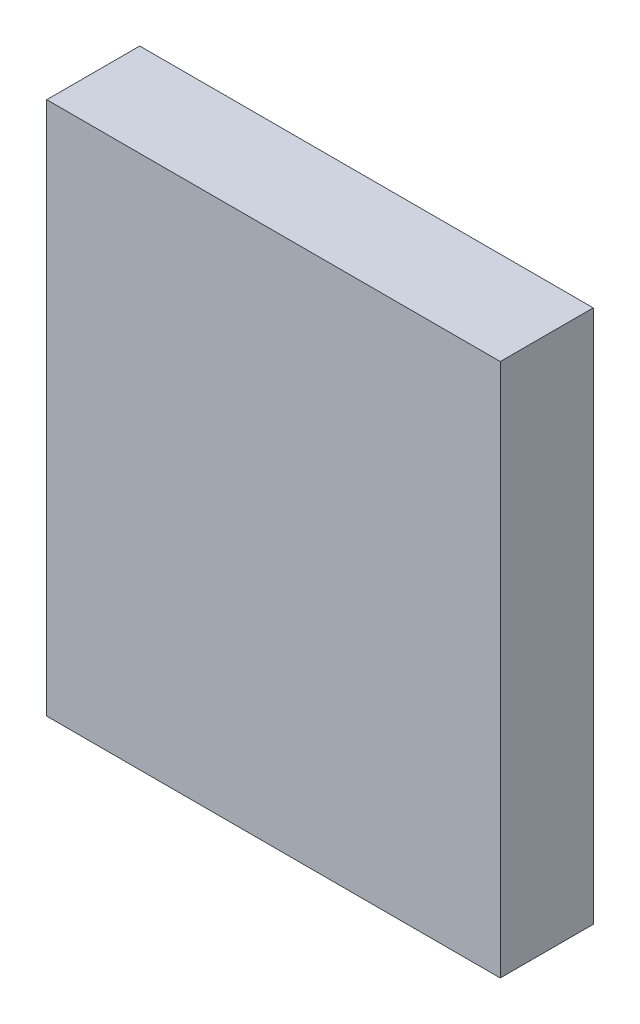
ISO-10303-21;
HEADER;
FILE_DESCRIPTION(('STEP AP214'),'2;1');
FILE_NAME('part.step','',(''),(''),'','','');
FILE_SCHEMA(('AUTOMOTIVE_DESIGN { 1 0 10303 214 1 1 1 1 }'));
ENDSEC;
DATA;
#1=APPLICATION_CONTEXT('core data for automotive mechanical design processes');
#2=APPLICATION_PROTOCOL_DEFINITION('international standard','automotive_design',2000,#1);
#3=PRODUCT_CONTEXT('',#1,'mechanical');
#4=PRODUCT('Part','Part','',(#3));
#5=PRODUCT_RELATED_PRODUCT_CATEGORY('part','',(#4));
#6=PRODUCT_DEFINITION_FORMATION('','',#4);
#7=PRODUCT_DEFINITION_CONTEXT('part definition',#1,'design');
#8=PRODUCT_DEFINITION('design','',#6,#7);
#9=PRODUCT_DEFINITION_SHAPE('','',#8);
#10=(LENGTH_UNIT() NAMED_UNIT(*) SI_UNIT(.MILLI.,.METRE.));
#11=(NAMED_UNIT(*) PLANE_ANGLE_UNIT() SI_UNIT($,.RADIAN.));
#12=(NAMED_UNIT(*) SI_UNIT($,.STERADIAN.) SOLID_ANGLE_UNIT());
#13=UNCERTAINTY_MEASURE_WITH_UNIT(LENGTH_MEASURE(1.E-05),#10,'distance_accuracy_value','');
#14=(GEOMETRIC_REPRESENTATION_CONTEXT(3) GLOBAL_UNCERTAINTY_ASSIGNED_CONTEXT((#13)) GLOBAL_UNIT_ASSIGNED_CONTEXT((#10,
#11,#12)) REPRESENTATION_CONTEXT('',''));
#15=CARTESIAN_POINT('',(0.,0.,0.));
#16=DIRECTION('',(0.,0.,1.));
#17=DIRECTION('',(1.,0.,0.));
#18=AXIS2_PLACEMENT_3D('',#15,#16,#17);
#19=CARTESIAN_POINT('',(-2.4382,-2.8702,1.));
#20=DIRECTION('',(1.,0.,0.));
#21=DIRECTION('',(0.,0.,-1.));
#22=AXIS2_PLACEMENT_3D('',#19,#20,#21);
#23=PLANE('',#22);
#24=DIRECTION('',(0.,-1.,0.));
#25=VECTOR('',#24,1.);
#26=CARTESIAN_POINT('',(-2.4382,-2.8702,0.));
#27=LINE('',#26,#25);
#28=CARTESIAN_POINT('',(-2.4382,2.8702,0.));
#29=VERTEX_POINT('',#28);
#30=CARTESIAN_POINT('',(-2.4382,-2.8702,0.));
#31=VERTEX_POINT('',#30);
#32=EDGE_CURVE('E96',#29,#31,#27,.T.);
#33=ORIENTED_EDGE('',*,*,#32,.T.);
#34=DIRECTION('',(0.,0.,-1.));
#35=VECTOR('',#34,1.);
#36=CARTESIAN_POINT('',(-2.4382,-2.8702,1.));
#37=LINE('',#36,#35);
#38=CARTESIAN_POINT('',(-2.4382,-2.8702,1.));
#39=VERTEX_POINT('',#38);
#40=EDGE_CURVE('E11',#39,#31,#37,.T.);
#41=ORIENTED_EDGE('',*,*,#40,.F.);
#42=DIRECTION('',(0.,-1.,0.));
#43=VECTOR('',#42,1.);
#44=CARTESIAN_POINT('',(-2.4382,-2.8702,1.));
#45=LINE('',#44,#43);
#46=CARTESIAN_POINT('',(-2.4382,2.8702,1.));
#47=VERTEX_POINT('',#46);
#48=EDGE_CURVE('E84',#47,#39,#45,.T.);
#49=ORIENTED_EDGE('',*,*,#48,.F.);
#50=DIRECTION('',(0.,0.,-1.));
#51=VECTOR('',#50,1.);
#52=CARTESIAN_POINT('',(-2.4382,2.8702,1.));
#53=LINE('',#52,#51);
#54=EDGE_CURVE('E92',#47,#29,#53,.T.);
#55=ORIENTED_EDGE('',*,*,#54,.T.);
#56=EDGE_LOOP('',(#33,#41,#49,#55));
#57=FACE_BOUND('',#56,.T.);
#58=ADVANCED_FACE('F33',(#57),#23,.F.);
#59=CARTESIAN_POINT('',(2.4382,-2.8702,1.));
#60=DIRECTION('',(0.,1.,0.));
#61=DIRECTION('',(0.,0.,1.));
#62=AXIS2_PLACEMENT_3D('',#59,#60,#61);
#63=PLANE('',#62);
#64=DIRECTION('',(1.,0.,0.));
#65=VECTOR('',#64,1.);
#66=CARTESIAN_POINT('',(2.4382,-2.8702,0.));
#67=LINE('',#66,#65);
#68=CARTESIAN_POINT('',(2.4382,-2.8702,0.));
#69=VERTEX_POINT('',#68);
#70=EDGE_CURVE('E88',#31,#69,#67,.T.);
#71=ORIENTED_EDGE('',*,*,#70,.T.);
#72=DIRECTION('',(0.,0.,-1.));
#73=VECTOR('',#72,1.);
#74=CARTESIAN_POINT('',(2.4382,-2.8702,1.));
#75=LINE('',#74,#73);
#76=CARTESIAN_POINT('',(2.4382,-2.8702,1.));
#77=VERTEX_POINT('',#76);
#78=EDGE_CURVE('E41',#77,#69,#75,.T.);
#79=ORIENTED_EDGE('',*,*,#78,.F.);
#80=DIRECTION('',(1.,0.,0.));
#81=VECTOR('',#80,1.);
#82=CARTESIAN_POINT('',(2.4382,-2.8702,1.));
#83=LINE('',#82,#81);
#84=EDGE_CURVE('E79',#39,#77,#83,.T.);
#85=ORIENTED_EDGE('',*,*,#84,.F.);
#86=ORIENTED_EDGE('',*,*,#40,.T.);
#87=EDGE_LOOP('',(#71,#79,#85,#86));
#88=FACE_BOUND('',#87,.T.);
#89=ADVANCED_FACE('F87',(#88),#63,.F.);
#90=CARTESIAN_POINT('',(2.4382,2.8702,1.));
#91=DIRECTION('',(-1.,0.,0.));
#92=DIRECTION('',(0.,0.,1.));
#93=AXIS2_PLACEMENT_3D('',#90,#91,#92);
#94=PLANE('',#93);
#95=DIRECTION('',(0.,1.,0.));
#96=VECTOR('',#95,1.);
#97=CARTESIAN_POINT('',(2.4382,2.8702,0.));
#98=LINE('',#97,#96);
#99=CARTESIAN_POINT('',(2.4382,2.8702,0.));
#100=VERTEX_POINT('',#99);
#101=EDGE_CURVE('E66',#69,#100,#98,.T.);
#102=ORIENTED_EDGE('',*,*,#101,.T.);
#103=DIRECTION('',(0.,0.,-1.));
#104=VECTOR('',#103,1.);
#105=CARTESIAN_POINT('',(2.4382,2.8702,1.));
#106=LINE('',#105,#104);
#107=CARTESIAN_POINT('',(2.4382,2.8702,1.));
#108=VERTEX_POINT('',#107);
#109=EDGE_CURVE('E89',#108,#100,#106,.T.);
#110=ORIENTED_EDGE('',*,*,#109,.F.);
#111=DIRECTION('',(0.,1.,0.));
#112=VECTOR('',#111,1.);
#113=CARTESIAN_POINT('',(2.4382,2.8702,1.));
#114=LINE('',#113,#112);
#115=EDGE_CURVE('E82',#77,#108,#114,.T.);
#116=ORIENTED_EDGE('',*,*,#115,.F.);
#117=ORIENTED_EDGE('',*,*,#78,.T.);
#118=EDGE_LOOP('',(#102,#110,#116,#117));
#119=FACE_BOUND('',#118,.T.);
#120=ADVANCED_FACE('F90',(#119),#94,.F.);
#121=CARTESIAN_POINT('',(-2.4382,2.8702,1.));
#122=DIRECTION('',(0.,-1.,0.));
#123=DIRECTION('',(0.,0.,-1.));
#124=AXIS2_PLACEMENT_3D('',#121,#122,#123);
#125=PLANE('',#124);
#126=DIRECTION('',(-1.,0.,0.));
#127=VECTOR('',#126,1.);
#128=CARTESIAN_POINT('',(-2.4382,2.8702,0.));
#129=LINE('',#128,#127);
#130=EDGE_CURVE('E72',#100,#29,#129,.T.);
#131=ORIENTED_EDGE('',*,*,#130,.T.);
#132=ORIENTED_EDGE('',*,*,#54,.F.);
#133=DIRECTION('',(-1.,0.,0.));
#134=VECTOR('',#133,1.);
#135=CARTESIAN_POINT('',(-2.4382,2.8702,1.));
#136=LINE('',#135,#134);
#137=EDGE_CURVE('E49',#108,#47,#136,.T.);
#138=ORIENTED_EDGE('',*,*,#137,.F.);
#139=ORIENTED_EDGE('',*,*,#109,.T.);
#140=EDGE_LOOP('',(#131,#132,#138,#139));
#141=FACE_BOUND('',#140,.T.);
#142=ADVANCED_FACE('F103',(#141),#125,.F.);
#143=CARTESIAN_POINT('',(0.,0.,1.));
#144=DIRECTION('',(0.,0.,-1.));
#145=DIRECTION('',(-1.,0.,0.));
#146=AXIS2_PLACEMENT_3D('',#143,#144,#145);
#147=PLANE('',#146);
#148=ORIENTED_EDGE('',*,*,#48,.T.);
#149=ORIENTED_EDGE('',*,*,#84,.T.);
#150=ORIENTED_EDGE('',*,*,#115,.T.);
#151=ORIENTED_EDGE('',*,*,#137,.T.);
#152=EDGE_LOOP('',(#148,#149,#150,#151));
#153=FACE_BOUND('',#152,.T.);
#154=ADVANCED_FACE('F80',(#153),#147,.F.);
#155=CARTESIAN_POINT('',(0.,0.,0.));
#156=DIRECTION('',(0.,0.,-1.));
#157=DIRECTION('',(-1.,0.,0.));
#158=AXIS2_PLACEMENT_3D('',#155,#156,#157);
#159=PLANE('',#158);
#160=ORIENTED_EDGE('',*,*,#32,.F.);
#161=ORIENTED_EDGE('',*,*,#130,.F.);
#162=ORIENTED_EDGE('',*,*,#101,.F.);
#163=ORIENTED_EDGE('',*,*,#70,.F.);
#164=EDGE_LOOP('',(#160,#161,#162,#163));
#165=FACE_BOUND('',#164,.T.);
#166=ADVANCED_FACE('F106',(#165),#159,.T.);
#167=CLOSED_SHELL('',(#58,#89,#120,#142,#154,#166));
#168=MANIFOLD_SOLID_BREP('B2',#167);
#169=ADVANCED_BREP_SHAPE_REPRESENTATION('',(#18,#168),#14);
#170=SHAPE_DEFINITION_REPRESENTATION(#9,#169);
ENDSEC;
END-ISO-10303-21;
